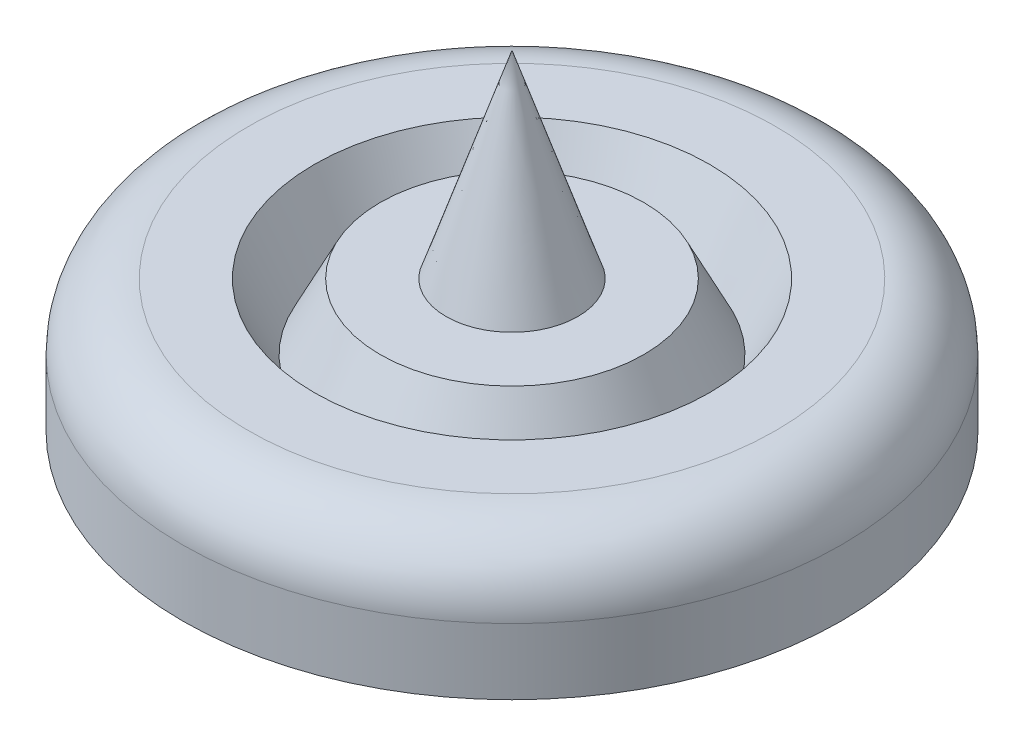
ISO-10303-21;
HEADER;
FILE_DESCRIPTION(('STEP AP214'),'2;1');
FILE_NAME('part.step','',(''),(''),'','','');
FILE_SCHEMA(('AUTOMOTIVE_DESIGN { 1 0 10303 214 1 1 1 1 }'));
ENDSEC;
DATA;
#1=APPLICATION_CONTEXT('core data for automotive mechanical design processes');
#2=APPLICATION_PROTOCOL_DEFINITION('international standard','automotive_design',2000,#1);
#3=PRODUCT_CONTEXT('',#1,'mechanical');
#4=PRODUCT('Part','Part','',(#3));
#5=PRODUCT_RELATED_PRODUCT_CATEGORY('part','',(#4));
#6=PRODUCT_DEFINITION_FORMATION('','',#4);
#7=PRODUCT_DEFINITION_CONTEXT('part definition',#1,'design');
#8=PRODUCT_DEFINITION('design','',#6,#7);
#9=PRODUCT_DEFINITION_SHAPE('','',#8);
#10=(LENGTH_UNIT() NAMED_UNIT(*) SI_UNIT(.MILLI.,.METRE.));
#11=(NAMED_UNIT(*) PLANE_ANGLE_UNIT() SI_UNIT($,.RADIAN.));
#12=(NAMED_UNIT(*) SI_UNIT($,.STERADIAN.) SOLID_ANGLE_UNIT());
#13=UNCERTAINTY_MEASURE_WITH_UNIT(LENGTH_MEASURE(1.E-05),#10,'distance_accuracy_value','');
#14=(GEOMETRIC_REPRESENTATION_CONTEXT(3) GLOBAL_UNCERTAINTY_ASSIGNED_CONTEXT((#13)) GLOBAL_UNIT_ASSIGNED_CONTEXT((#10,
#11,#12)) REPRESENTATION_CONTEXT('',''));
#15=CARTESIAN_POINT('',(0.,0.,0.));
#16=DIRECTION('',(0.,0.,1.));
#17=DIRECTION('',(1.,0.,0.));
#18=AXIS2_PLACEMENT_3D('',#15,#16,#17);
#19=CARTESIAN_POINT('',(25.4,0.,0.));
#20=DIRECTION('',(0.,1.,0.));
#21=DIRECTION('',(-1.,0.,0.));
#22=AXIS2_PLACEMENT_3D('',#19,#20,#21);
#23=PLANE('',#22);
#24=CARTESIAN_POINT('',(0.,0.,0.));
#25=DIRECTION('',(0.,1.,0.));
#26=DIRECTION('',(-1.,0.,0.));
#27=AXIS2_PLACEMENT_3D('',#24,#25,#26);
#28=CIRCLE('',#27,127.);
#29=CARTESIAN_POINT('',(-127.,0.,0.));
#30=VERTEX_POINT('',#29);
#31=EDGE_CURVE('E73',#30,#30,#28,.T.);
#32=ORIENTED_EDGE('',*,*,#31,.F.);
#33=EDGE_LOOP('',(#32));
#34=FACE_BOUND('',#33,.T.);
#35=CARTESIAN_POINT('',(0.,0.,0.));
#36=DIRECTION('',(0.,1.,0.));
#37=DIRECTION('',(-1.,0.,0.));
#38=AXIS2_PLACEMENT_3D('',#35,#36,#37);
#39=CIRCLE('',#38,25.4);
#40=CARTESIAN_POINT('',(-25.4,0.,0.));
#41=VERTEX_POINT('',#40);
#42=EDGE_CURVE('E60',#41,#41,#39,.T.);
#43=ORIENTED_EDGE('',*,*,#42,.T.);
#44=EDGE_LOOP('',(#43));
#45=FACE_BOUND('',#44,.T.);
#46=ADVANCED_FACE('F35',(#34,#45),#23,.F.);
#47=CARTESIAN_POINT('',(0.,127.,0.));
#48=DIRECTION('',(0.,1.,0.));
#49=DIRECTION('',(-1.,0.,0.));
#50=AXIS2_PLACEMENT_3D('',#47,#48,#49);
#51=CYLINDRICAL_SURFACE('',#50,127.);
#52=CARTESIAN_POINT('',(0.,25.4,0.));
#53=DIRECTION('',(0.,-1.,0.));
#54=DIRECTION('',(1.,0.,0.));
#55=AXIS2_PLACEMENT_3D('',#52,#53,#54);
#56=CIRCLE('',#55,127.);
#57=CARTESIAN_POINT('',(127.,25.4,0.));
#58=VERTEX_POINT('',#57);
#59=EDGE_CURVE('E11',#58,#58,#56,.T.);
#60=ORIENTED_EDGE('',*,*,#59,.T.);
#61=EDGE_LOOP('',(#60));
#62=FACE_BOUND('',#61,.T.);
#63=ORIENTED_EDGE('',*,*,#31,.T.);
#64=EDGE_LOOP('',(#63));
#65=FACE_BOUND('',#64,.T.);
#66=ADVANCED_FACE('F90',(#62,#65),#51,.T.);
#67=CARTESIAN_POINT('',(127.,50.8,0.));
#68=DIRECTION('',(0.,-1.,0.));
#69=DIRECTION('',(1.,0.,0.));
#70=AXIS2_PLACEMENT_3D('',#67,#68,#69);
#71=PLANE('',#70);
#72=CARTESIAN_POINT('',(0.,50.8,0.));
#73=DIRECTION('',(0.,-1.,0.));
#74=DIRECTION('',(1.,0.,0.));
#75=AXIS2_PLACEMENT_3D('',#72,#73,#74);
#76=CIRCLE('',#75,101.6);
#77=CARTESIAN_POINT('',(101.6,50.8,0.));
#78=VERTEX_POINT('',#77);
#79=EDGE_CURVE('E43',#78,#78,#76,.F.);
#80=ORIENTED_EDGE('',*,*,#79,.T.);
#81=EDGE_LOOP('',(#80));
#82=FACE_BOUND('',#81,.T.);
#83=CARTESIAN_POINT('',(0.,50.8,0.));
#84=DIRECTION('',(0.,1.,0.));
#85=DIRECTION('',(-1.,0.,0.));
#86=AXIS2_PLACEMENT_3D('',#83,#84,#85);
#87=CIRCLE('',#86,76.2);
#88=CARTESIAN_POINT('',(-76.2,50.8,0.));
#89=VERTEX_POINT('',#88);
#90=EDGE_CURVE('E70',#89,#89,#87,.T.);
#91=ORIENTED_EDGE('',*,*,#90,.F.);
#92=EDGE_LOOP('',(#91));
#93=FACE_BOUND('',#92,.T.);
#94=ADVANCED_FACE('F78',(#82,#93),#71,.F.);
#95=CARTESIAN_POINT('',(0.,50.8,0.));
#96=DIRECTION('',(0.,1.,0.));
#97=DIRECTION('',(-1.,0.,0.));
#98=AXIS2_PLACEMENT_3D('',#95,#96,#97);
#99=CONICAL_SURFACE('',#98,76.2,0.463647609000807);
#100=CARTESIAN_POINT('',(0.,25.4,0.));
#101=DIRECTION('',(0.,1.,0.));
#102=DIRECTION('',(-1.,0.,0.));
#103=AXIS2_PLACEMENT_3D('',#100,#101,#102);
#104=CIRCLE('',#103,63.5);
#105=CARTESIAN_POINT('',(-63.5,25.4,0.));
#106=VERTEX_POINT('',#105);
#107=EDGE_CURVE('E63',#106,#106,#104,.T.);
#108=ORIENTED_EDGE('',*,*,#107,.F.);
#109=EDGE_LOOP('',(#108));
#110=FACE_BOUND('',#109,.T.);
#111=ORIENTED_EDGE('',*,*,#90,.T.);
#112=EDGE_LOOP('',(#111));
#113=FACE_BOUND('',#112,.T.);
#114=ADVANCED_FACE('F102',(#110,#113),#99,.F.);
#115=CARTESIAN_POINT('',(0.,25.4,0.));
#116=DIRECTION('',(0.,-1.,0.));
#117=DIRECTION('',(1.,0.,0.));
#118=AXIS2_PLACEMENT_3D('',#115,#116,#117);
#119=CONICAL_SURFACE('',#118,63.5,0.463647609000806);
#120=CARTESIAN_POINT('',(0.,50.8,0.));
#121=DIRECTION('',(0.,1.,0.));
#122=DIRECTION('',(-1.,0.,0.));
#123=AXIS2_PLACEMENT_3D('',#120,#121,#122);
#124=CIRCLE('',#123,50.8);
#125=CARTESIAN_POINT('',(-50.8,50.8,0.));
#126=VERTEX_POINT('',#125);
#127=EDGE_CURVE('E59',#126,#126,#124,.T.);
#128=ORIENTED_EDGE('',*,*,#127,.F.);
#129=EDGE_LOOP('',(#128));
#130=FACE_BOUND('',#129,.T.);
#131=ORIENTED_EDGE('',*,*,#107,.T.);
#132=EDGE_LOOP('',(#131));
#133=FACE_BOUND('',#132,.T.);
#134=ADVANCED_FACE('F105',(#130,#133),#119,.T.);
#135=CARTESIAN_POINT('',(50.8,50.8,0.));
#136=DIRECTION('',(0.,-1.,0.));
#137=DIRECTION('',(1.,0.,0.));
#138=AXIS2_PLACEMENT_3D('',#135,#136,#137);
#139=PLANE('',#138);
#140=CARTESIAN_POINT('',(0.,50.8,0.));
#141=DIRECTION('',(0.,1.,0.));
#142=DIRECTION('',(-1.,0.,0.));
#143=AXIS2_PLACEMENT_3D('',#140,#141,#142);
#144=CIRCLE('',#143,25.4);
#145=CARTESIAN_POINT('',(-25.4,50.8,0.));
#146=VERTEX_POINT('',#145);
#147=EDGE_CURVE('E57',#146,#146,#144,.T.);
#148=ORIENTED_EDGE('',*,*,#147,.F.);
#149=EDGE_LOOP('',(#148));
#150=FACE_BOUND('',#149,.T.);
#151=ORIENTED_EDGE('',*,*,#127,.T.);
#152=EDGE_LOOP('',(#151));
#153=FACE_BOUND('',#152,.T.);
#154=ADVANCED_FACE('F53',(#150,#153),#139,.F.);
#155=CARTESIAN_POINT('',(0.,50.8,0.));
#156=DIRECTION('',(0.,-1.,0.));
#157=DIRECTION('',(1.,0.,0.));
#158=AXIS2_PLACEMENT_3D('',#155,#156,#157);
#159=CONICAL_SURFACE('',#158,25.4,0.321750554396642);
#160=CARTESIAN_POINT('',(0.,127.,0.));
#161=VERTEX_POINT('',#160);
#162=VERTEX_LOOP('',#161);
#163=FACE_BOUND('',#162,.T.);
#164=ORIENTED_EDGE('',*,*,#147,.T.);
#165=EDGE_LOOP('',(#164));
#166=FACE_BOUND('',#165,.T.);
#167=ADVANCED_FACE('F49',(#163,#166),#159,.T.);
#168=CARTESIAN_POINT('',(0.,25.4,0.));
#169=DIRECTION('',(0.,-1.,0.));
#170=DIRECTION('',(1.,0.,0.));
#171=AXIS2_PLACEMENT_3D('',#168,#169,#170);
#172=CONICAL_SURFACE('',#171,0.,0.785398163397448);
#173=ORIENTED_EDGE('',*,*,#42,.F.);
#174=EDGE_LOOP('',(#173));
#175=FACE_BOUND('',#174,.T.);
#176=CARTESIAN_POINT('',(0.,25.4,0.));
#177=VERTEX_POINT('',#176);
#178=VERTEX_LOOP('',#177);
#179=FACE_BOUND('',#178,.T.);
#180=ADVANCED_FACE('F52',(#175,#179),#172,.F.);
#181=CARTESIAN_POINT('',(0.,25.4,0.));
#182=DIRECTION('',(0.,-1.,0.));
#183=DIRECTION('',(1.,0.,0.));
#184=AXIS2_PLACEMENT_3D('',#181,#182,#183);
#185=TOROIDAL_SURFACE('',#184,101.6,25.4);
#186=ORIENTED_EDGE('',*,*,#59,.F.);
#187=EDGE_LOOP('',(#186));
#188=FACE_BOUND('',#187,.T.);
#189=ORIENTED_EDGE('',*,*,#79,.F.);
#190=EDGE_LOOP('',(#189));
#191=FACE_BOUND('',#190,.T.);
#192=ADVANCED_FACE('F37',(#188,#191),#185,.T.);
#193=CLOSED_SHELL('',(#46,#66,#94,#114,#134,#154,#167,#180,#192));
#194=MANIFOLD_SOLID_BREP('B2',#193);
#195=ADVANCED_BREP_SHAPE_REPRESENTATION('',(#18,#194),#14);
#196=SHAPE_DEFINITION_REPRESENTATION(#9,#195);
ENDSEC;
END-ISO-10303-21;
